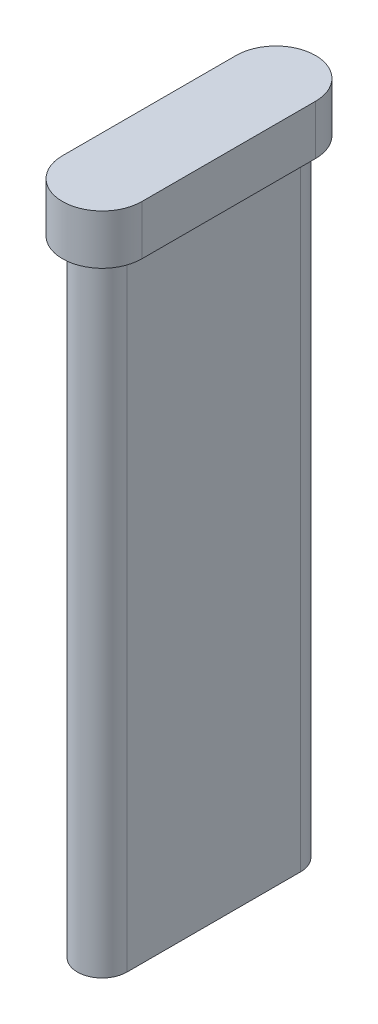
ISO-10303-21;
HEADER;
FILE_DESCRIPTION(('STEP AP214'),'2;1');
FILE_NAME('part.step','',(''),(''),'','','');
FILE_SCHEMA(('AUTOMOTIVE_DESIGN { 1 0 10303 214 1 1 1 1 }'));
ENDSEC;
DATA;
#1=APPLICATION_CONTEXT('core data for automotive mechanical design processes');
#2=APPLICATION_PROTOCOL_DEFINITION('international standard','automotive_design',2000,#1);
#3=PRODUCT_CONTEXT('',#1,'mechanical');
#4=PRODUCT('Part','Part','',(#3));
#5=PRODUCT_RELATED_PRODUCT_CATEGORY('part','',(#4));
#6=PRODUCT_DEFINITION_FORMATION('','',#4);
#7=PRODUCT_DEFINITION_CONTEXT('part definition',#1,'design');
#8=PRODUCT_DEFINITION('design','',#6,#7);
#9=PRODUCT_DEFINITION_SHAPE('','',#8);
#10=(LENGTH_UNIT() NAMED_UNIT(*) SI_UNIT(.MILLI.,.METRE.));
#11=(NAMED_UNIT(*) PLANE_ANGLE_UNIT() SI_UNIT($,.RADIAN.));
#12=(NAMED_UNIT(*) SI_UNIT($,.STERADIAN.) SOLID_ANGLE_UNIT());
#13=UNCERTAINTY_MEASURE_WITH_UNIT(LENGTH_MEASURE(1.E-05),#10,'distance_accuracy_value','');
#14=(GEOMETRIC_REPRESENTATION_CONTEXT(3) GLOBAL_UNCERTAINTY_ASSIGNED_CONTEXT((#13)) GLOBAL_UNIT_ASSIGNED_CONTEXT((#10,
#11,#12)) REPRESENTATION_CONTEXT('',''));
#15=CARTESIAN_POINT('',(0.,0.,0.));
#16=DIRECTION('',(0.,0.,1.));
#17=DIRECTION('',(1.,0.,0.));
#18=AXIS2_PLACEMENT_3D('',#15,#16,#17);
#19=CARTESIAN_POINT('',(0.,-68.,8.75));
#20=DIRECTION('',(0.,1.,0.));
#21=DIRECTION('',(0.,0.,1.));
#22=AXIS2_PLACEMENT_3D('',#19,#20,#21);
#23=CYLINDRICAL_SURFACE('',#22,2.5);
#24=DIRECTION('',(0.,1.,0.));
#25=VECTOR('',#24,1.);
#26=CARTESIAN_POINT('',(2.5,-68.,8.75));
#27=LINE('',#26,#25);
#28=CARTESIAN_POINT('',(2.5,-68.,8.75));
#29=VERTEX_POINT('',#28);
#30=CARTESIAN_POINT('',(2.5,-5.,8.75));
#31=VERTEX_POINT('',#30);
#32=EDGE_CURVE('E162',#29,#31,#27,.T.);
#33=ORIENTED_EDGE('',*,*,#32,.T.);
#34=CARTESIAN_POINT('',(0.,-5.,8.75));
#35=DIRECTION('',(0.,1.,0.));
#36=DIRECTION('',(0.,0.,1.));
#37=AXIS2_PLACEMENT_3D('',#34,#35,#36);
#38=CIRCLE('',#37,2.5);
#39=CARTESIAN_POINT('',(-2.5,-5.,8.75));
#40=VERTEX_POINT('',#39);
#41=EDGE_CURVE('E53',#31,#40,#38,.F.);
#42=ORIENTED_EDGE('',*,*,#41,.T.);
#43=DIRECTION('',(0.,1.,0.));
#44=VECTOR('',#43,1.);
#45=CARTESIAN_POINT('',(-2.5,-68.,8.75));
#46=LINE('',#45,#44);
#47=CARTESIAN_POINT('',(-2.5,-68.,8.75));
#48=VERTEX_POINT('',#47);
#49=EDGE_CURVE('E46',#48,#40,#46,.T.);
#50=ORIENTED_EDGE('',*,*,#49,.F.);
#51=CARTESIAN_POINT('',(0.,-68.,8.75));
#52=DIRECTION('',(0.,1.,0.));
#53=DIRECTION('',(0.,0.,1.));
#54=AXIS2_PLACEMENT_3D('',#51,#52,#53);
#55=CIRCLE('',#54,2.5);
#56=EDGE_CURVE('E151',#48,#29,#55,.T.);
#57=ORIENTED_EDGE('',*,*,#56,.T.);
#58=EDGE_LOOP('',(#33,#42,#50,#57));
#59=FACE_BOUND('',#58,.T.);
#60=ADVANCED_FACE('F39',(#59),#23,.T.);
#61=CARTESIAN_POINT('',(-2.5,-68.,8.75));
#62=DIRECTION('',(-1.,0.,0.));
#63=DIRECTION('',(0.,0.,1.));
#64=AXIS2_PLACEMENT_3D('',#61,#62,#63);
#65=PLANE('',#64);
#66=ORIENTED_EDGE('',*,*,#49,.T.);
#67=DIRECTION('',(0.,0.,-1.));
#68=VECTOR('',#67,1.);
#69=CARTESIAN_POINT('',(-2.5,-5.,8.75));
#70=LINE('',#69,#68);
#71=CARTESIAN_POINT('',(-2.50000000000001,-5.,-8.75));
#72=VERTEX_POINT('',#71);
#73=EDGE_CURVE('E147',#40,#72,#70,.T.);
#74=ORIENTED_EDGE('',*,*,#73,.T.);
#75=DIRECTION('',(0.,1.,0.));
#76=VECTOR('',#75,1.);
#77=CARTESIAN_POINT('',(-2.50000000000001,-68.,-8.75));
#78=LINE('',#77,#76);
#79=CARTESIAN_POINT('',(-2.50000000000001,-68.,-8.75));
#80=VERTEX_POINT('',#79);
#81=EDGE_CURVE('E164',#80,#72,#78,.T.);
#82=ORIENTED_EDGE('',*,*,#81,.F.);
#83=DIRECTION('',(0.,0.,1.));
#84=VECTOR('',#83,1.);
#85=CARTESIAN_POINT('',(-2.5,-68.,8.75));
#86=LINE('',#85,#84);
#87=EDGE_CURVE('E159',#80,#48,#86,.T.);
#88=ORIENTED_EDGE('',*,*,#87,.T.);
#89=EDGE_LOOP('',(#66,#74,#82,#88));
#90=FACE_BOUND('',#89,.T.);
#91=ADVANCED_FACE('F180',(#90),#65,.T.);
#92=CARTESIAN_POINT('',(0.,-68.,-8.75));
#93=DIRECTION('',(0.,1.,0.));
#94=DIRECTION('',(0.,0.,1.));
#95=AXIS2_PLACEMENT_3D('',#92,#93,#94);
#96=CYLINDRICAL_SURFACE('',#95,2.5);
#97=ORIENTED_EDGE('',*,*,#81,.T.);
#98=CARTESIAN_POINT('',(0.,-5.,-8.75));
#99=DIRECTION('',(0.,1.,0.));
#100=DIRECTION('',(0.,0.,1.));
#101=AXIS2_PLACEMENT_3D('',#98,#99,#100);
#102=CIRCLE('',#101,2.5);
#103=CARTESIAN_POINT('',(2.5,-5.,-8.75));
#104=VERTEX_POINT('',#103);
#105=EDGE_CURVE('E141',#72,#104,#102,.F.);
#106=ORIENTED_EDGE('',*,*,#105,.T.);
#107=DIRECTION('',(0.,1.,0.));
#108=VECTOR('',#107,1.);
#109=CARTESIAN_POINT('',(2.5,-68.,-8.75));
#110=LINE('',#109,#108);
#111=CARTESIAN_POINT('',(2.5,-68.,-8.75));
#112=VERTEX_POINT('',#111);
#113=EDGE_CURVE('E167',#112,#104,#110,.T.);
#114=ORIENTED_EDGE('',*,*,#113,.F.);
#115=CARTESIAN_POINT('',(0.,-68.,-8.75));
#116=DIRECTION('',(0.,1.,0.));
#117=DIRECTION('',(0.,0.,1.));
#118=AXIS2_PLACEMENT_3D('',#115,#116,#117);
#119=CIRCLE('',#118,2.5);
#120=EDGE_CURVE('E156',#112,#80,#119,.T.);
#121=ORIENTED_EDGE('',*,*,#120,.T.);
#122=EDGE_LOOP('',(#97,#106,#114,#121));
#123=FACE_BOUND('',#122,.T.);
#124=ADVANCED_FACE('F178',(#123),#96,.T.);
#125=CARTESIAN_POINT('',(2.5,-68.,8.75));
#126=DIRECTION('',(1.,0.,0.));
#127=DIRECTION('',(0.,0.,-1.));
#128=AXIS2_PLACEMENT_3D('',#125,#126,#127);
#129=PLANE('',#128);
#130=ORIENTED_EDGE('',*,*,#113,.T.);
#131=DIRECTION('',(0.,0.,1.));
#132=VECTOR('',#131,1.);
#133=CARTESIAN_POINT('',(2.5,-5.,8.75));
#134=LINE('',#133,#132);
#135=EDGE_CURVE('E11',#104,#31,#134,.T.);
#136=ORIENTED_EDGE('',*,*,#135,.T.);
#137=ORIENTED_EDGE('',*,*,#32,.F.);
#138=DIRECTION('',(0.,0.,-1.));
#139=VECTOR('',#138,1.);
#140=CARTESIAN_POINT('',(2.5,-68.,8.75));
#141=LINE('',#140,#139);
#142=EDGE_CURVE('E153',#29,#112,#141,.T.);
#143=ORIENTED_EDGE('',*,*,#142,.T.);
#144=EDGE_LOOP('',(#130,#136,#137,#143));
#145=FACE_BOUND('',#144,.T.);
#146=ADVANCED_FACE('F172',(#145),#129,.T.);
#147=CARTESIAN_POINT('',(0.,-68.,8.75));
#148=DIRECTION('',(0.,1.,0.));
#149=DIRECTION('',(0.,0.,1.));
#150=AXIS2_PLACEMENT_3D('',#147,#148,#149);
#151=PLANE('',#150);
#152=ORIENTED_EDGE('',*,*,#56,.F.);
#153=ORIENTED_EDGE('',*,*,#87,.F.);
#154=ORIENTED_EDGE('',*,*,#120,.F.);
#155=ORIENTED_EDGE('',*,*,#142,.F.);
#156=EDGE_LOOP('',(#152,#153,#154,#155));
#157=FACE_BOUND('',#156,.T.);
#158=ADVANCED_FACE('F175',(#157),#151,.F.);
#159=CARTESIAN_POINT('',(0.,-5.,8.75));
#160=DIRECTION('',(0.,1.,0.));
#161=DIRECTION('',(0.,0.,1.));
#162=AXIS2_PLACEMENT_3D('',#159,#160,#161);
#163=CYLINDRICAL_SURFACE('',#162,4.);
#164=CARTESIAN_POINT('',(0.,0.,8.75));
#165=DIRECTION('',(0.,1.,0.));
#166=DIRECTION('',(0.,0.,1.));
#167=AXIS2_PLACEMENT_3D('',#164,#165,#166);
#168=CIRCLE('',#167,4.);
#169=CARTESIAN_POINT('',(-4.,0.,8.75));
#170=VERTEX_POINT('',#169);
#171=CARTESIAN_POINT('',(4.,0.,8.75));
#172=VERTEX_POINT('',#171);
#173=EDGE_CURVE('E135',#170,#172,#168,.T.);
#174=ORIENTED_EDGE('',*,*,#173,.F.);
#175=DIRECTION('',(0.,1.,0.));
#176=VECTOR('',#175,1.);
#177=CARTESIAN_POINT('',(-4.,-5.,8.75));
#178=LINE('',#177,#176);
#179=CARTESIAN_POINT('',(-4.,-5.,8.75));
#180=VERTEX_POINT('',#179);
#181=EDGE_CURVE('E126',#180,#170,#178,.T.);
#182=ORIENTED_EDGE('',*,*,#181,.F.);
#183=CARTESIAN_POINT('',(0.,-5.,8.75));
#184=DIRECTION('',(0.,1.,0.));
#185=DIRECTION('',(0.,0.,1.));
#186=AXIS2_PLACEMENT_3D('',#183,#184,#185);
#187=CIRCLE('',#186,4.);
#188=CARTESIAN_POINT('',(4.,-5.,8.75));
#189=VERTEX_POINT('',#188);
#190=EDGE_CURVE('E120',#180,#189,#187,.T.);
#191=ORIENTED_EDGE('',*,*,#190,.T.);
#192=DIRECTION('',(0.,1.,0.));
#193=VECTOR('',#192,1.);
#194=CARTESIAN_POINT('',(4.,-5.,8.75));
#195=LINE('',#194,#193);
#196=EDGE_CURVE('E102',#189,#172,#195,.T.);
#197=ORIENTED_EDGE('',*,*,#196,.T.);
#198=EDGE_LOOP('',(#174,#182,#191,#197));
#199=FACE_BOUND('',#198,.T.);
#200=ADVANCED_FACE('F125',(#199),#163,.T.);
#201=CARTESIAN_POINT('',(-4.00000000000001,-5.,-8.75));
#202=DIRECTION('',(-1.,0.,0.));
#203=DIRECTION('',(0.,0.,1.));
#204=AXIS2_PLACEMENT_3D('',#201,#202,#203);
#205=PLANE('',#204);
#206=DIRECTION('',(0.,0.,1.));
#207=VECTOR('',#206,1.);
#208=CARTESIAN_POINT('',(-4.00000000000001,0.,-8.75));
#209=LINE('',#208,#207);
#210=CARTESIAN_POINT('',(-4.00000000000001,0.,-8.75));
#211=VERTEX_POINT('',#210);
#212=EDGE_CURVE('E127',#211,#170,#209,.T.);
#213=ORIENTED_EDGE('',*,*,#212,.F.);
#214=DIRECTION('',(0.,1.,0.));
#215=VECTOR('',#214,1.);
#216=CARTESIAN_POINT('',(-4.00000000000001,-5.,-8.75));
#217=LINE('',#216,#215);
#218=CARTESIAN_POINT('',(-4.00000000000001,-5.,-8.75));
#219=VERTEX_POINT('',#218);
#220=EDGE_CURVE('E142',#219,#211,#217,.T.);
#221=ORIENTED_EDGE('',*,*,#220,.F.);
#222=DIRECTION('',(0.,0.,1.));
#223=VECTOR('',#222,1.);
#224=CARTESIAN_POINT('',(-4.00000000000001,-5.,-8.75));
#225=LINE('',#224,#223);
#226=EDGE_CURVE('E113',#219,#180,#225,.T.);
#227=ORIENTED_EDGE('',*,*,#226,.T.);
#228=ORIENTED_EDGE('',*,*,#181,.T.);
#229=EDGE_LOOP('',(#213,#221,#227,#228));
#230=FACE_BOUND('',#229,.T.);
#231=ADVANCED_FACE('F198',(#230),#205,.T.);
#232=CARTESIAN_POINT('',(0.,-5.,-8.75));
#233=DIRECTION('',(0.,1.,0.));
#234=DIRECTION('',(0.,0.,1.));
#235=AXIS2_PLACEMENT_3D('',#232,#233,#234);
#236=CYLINDRICAL_SURFACE('',#235,4.);
#237=CARTESIAN_POINT('',(0.,0.,-8.75));
#238=DIRECTION('',(0.,1.,0.));
#239=DIRECTION('',(0.,0.,1.));
#240=AXIS2_PLACEMENT_3D('',#237,#238,#239);
#241=CIRCLE('',#240,4.);
#242=CARTESIAN_POINT('',(4.,0.,-8.75));
#243=VERTEX_POINT('',#242);
#244=EDGE_CURVE('E130',#243,#211,#241,.T.);
#245=ORIENTED_EDGE('',*,*,#244,.F.);
#246=DIRECTION('',(0.,1.,0.));
#247=VECTOR('',#246,1.);
#248=CARTESIAN_POINT('',(4.,-5.,-8.75));
#249=LINE('',#248,#247);
#250=CARTESIAN_POINT('',(4.,-5.,-8.75));
#251=VERTEX_POINT('',#250);
#252=EDGE_CURVE('E112',#251,#243,#249,.T.);
#253=ORIENTED_EDGE('',*,*,#252,.F.);
#254=CARTESIAN_POINT('',(0.,-5.,-8.75));
#255=DIRECTION('',(0.,1.,0.));
#256=DIRECTION('',(0.,0.,1.));
#257=AXIS2_PLACEMENT_3D('',#254,#255,#256);
#258=CIRCLE('',#257,4.);
#259=EDGE_CURVE('E123',#251,#219,#258,.T.);
#260=ORIENTED_EDGE('',*,*,#259,.T.);
#261=ORIENTED_EDGE('',*,*,#220,.T.);
#262=EDGE_LOOP('',(#245,#253,#260,#261));
#263=FACE_BOUND('',#262,.T.);
#264=ADVANCED_FACE('F203',(#263),#236,.T.);
#265=CARTESIAN_POINT('',(4.,-5.,8.75));
#266=DIRECTION('',(1.,0.,0.));
#267=DIRECTION('',(0.,0.,-1.));
#268=AXIS2_PLACEMENT_3D('',#265,#266,#267);
#269=PLANE('',#268);
#270=DIRECTION('',(0.,0.,-1.));
#271=VECTOR('',#270,1.);
#272=CARTESIAN_POINT('',(4.,0.,8.75));
#273=LINE('',#272,#271);
#274=EDGE_CURVE('E107',#172,#243,#273,.T.);
#275=ORIENTED_EDGE('',*,*,#274,.F.);
#276=ORIENTED_EDGE('',*,*,#196,.F.);
#277=DIRECTION('',(0.,0.,-1.));
#278=VECTOR('',#277,1.);
#279=CARTESIAN_POINT('',(4.,-5.,8.75));
#280=LINE('',#279,#278);
#281=EDGE_CURVE('E105',#189,#251,#280,.T.);
#282=ORIENTED_EDGE('',*,*,#281,.T.);
#283=ORIENTED_EDGE('',*,*,#252,.T.);
#284=EDGE_LOOP('',(#275,#276,#282,#283));
#285=FACE_BOUND('',#284,.T.);
#286=ADVANCED_FACE('F104',(#285),#269,.T.);
#287=CARTESIAN_POINT('',(0.,-5.,8.75));
#288=DIRECTION('',(0.,1.,0.));
#289=DIRECTION('',(0.,0.,1.));
#290=AXIS2_PLACEMENT_3D('',#287,#288,#289);
#291=PLANE('',#290);
#292=ORIENTED_EDGE('',*,*,#41,.F.);
#293=ORIENTED_EDGE('',*,*,#135,.F.);
#294=ORIENTED_EDGE('',*,*,#105,.F.);
#295=ORIENTED_EDGE('',*,*,#73,.F.);
#296=EDGE_LOOP('',(#292,#293,#294,#295));
#297=FACE_BOUND('',#296,.T.);
#298=ORIENTED_EDGE('',*,*,#190,.F.);
#299=ORIENTED_EDGE('',*,*,#226,.F.);
#300=ORIENTED_EDGE('',*,*,#259,.F.);
#301=ORIENTED_EDGE('',*,*,#281,.F.);
#302=EDGE_LOOP('',(#298,#299,#300,#301));
#303=FACE_BOUND('',#302,.T.);
#304=ADVANCED_FACE('F118',(#297,#303),#291,.F.);
#305=CARTESIAN_POINT('',(0.,0.,8.75));
#306=DIRECTION('',(0.,1.,0.));
#307=DIRECTION('',(0.,0.,1.));
#308=AXIS2_PLACEMENT_3D('',#305,#306,#307);
#309=PLANE('',#308);
#310=ORIENTED_EDGE('',*,*,#173,.T.);
#311=ORIENTED_EDGE('',*,*,#274,.T.);
#312=ORIENTED_EDGE('',*,*,#244,.T.);
#313=ORIENTED_EDGE('',*,*,#212,.T.);
#314=EDGE_LOOP('',(#310,#311,#312,#313));
#315=FACE_BOUND('',#314,.T.);
#316=ADVANCED_FACE('F189',(#315),#309,.T.);
#317=CLOSED_SHELL('',(#60,#91,#124,#146,#158,#200,#231,#264,#286,#304,#316));
#318=MANIFOLD_SOLID_BREP('B2',#317);
#319=ADVANCED_BREP_SHAPE_REPRESENTATION('',(#18,#318),#14);
#320=SHAPE_DEFINITION_REPRESENTATION(#9,#319);
ENDSEC;
END-ISO-10303-21;
